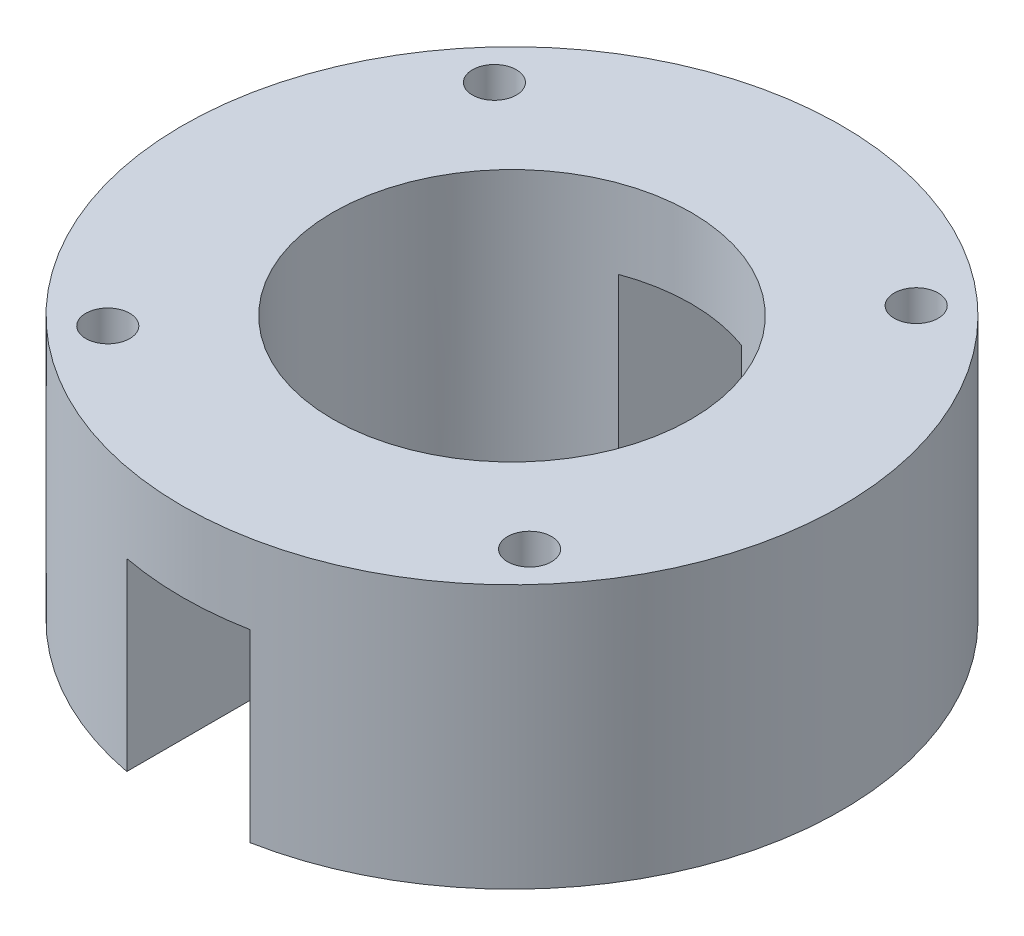
ISO-10303-21;
HEADER;
FILE_DESCRIPTION(('STEP AP214'),'2;1');
FILE_NAME('part.step','',(''),(''),'','','');
FILE_SCHEMA(('AUTOMOTIVE_DESIGN { 1 0 10303 214 1 1 1 1 }'));
ENDSEC;
DATA;
#1=APPLICATION_CONTEXT('core data for automotive mechanical design processes');
#2=APPLICATION_PROTOCOL_DEFINITION('international standard','automotive_design',2000,#1);
#3=PRODUCT_CONTEXT('',#1,'mechanical');
#4=PRODUCT('Part','Part','',(#3));
#5=PRODUCT_RELATED_PRODUCT_CATEGORY('part','',(#4));
#6=PRODUCT_DEFINITION_FORMATION('','',#4);
#7=PRODUCT_DEFINITION_CONTEXT('part definition',#1,'design');
#8=PRODUCT_DEFINITION('design','',#6,#7);
#9=PRODUCT_DEFINITION_SHAPE('','',#8);
#10=(LENGTH_UNIT() NAMED_UNIT(*) SI_UNIT(.MILLI.,.METRE.));
#11=(NAMED_UNIT(*) PLANE_ANGLE_UNIT() SI_UNIT($,.RADIAN.));
#12=(NAMED_UNIT(*) SI_UNIT($,.STERADIAN.) SOLID_ANGLE_UNIT());
#13=UNCERTAINTY_MEASURE_WITH_UNIT(LENGTH_MEASURE(1.E-05),#10,'distance_accuracy_value','');
#14=(GEOMETRIC_REPRESENTATION_CONTEXT(3) GLOBAL_UNCERTAINTY_ASSIGNED_CONTEXT((#13)) GLOBAL_UNIT_ASSIGNED_CONTEXT((#10,
#11,#12)) REPRESENTATION_CONTEXT('',''));
#15=CARTESIAN_POINT('',(0.,0.,0.));
#16=DIRECTION('',(0.,0.,1.));
#17=DIRECTION('',(1.,0.,0.));
#18=AXIS2_PLACEMENT_3D('',#15,#16,#17);
#19=CARTESIAN_POINT('',(7.,21.,-57.5));
#20=DIRECTION('',(0.,1.,0.));
#21=DIRECTION('',(0.,0.,1.));
#22=AXIS2_PLACEMENT_3D('',#19,#20,#21);
#23=PLANE('',#22);
#24=DIRECTION('',(0.,0.,1.));
#25=VECTOR('',#24,1.);
#26=CARTESIAN_POINT('',(7.,21.,-57.5));
#27=LINE('',#26,#25);
#28=CARTESIAN_POINT('',(7.,21.,-36.8408740395773));
#29=VERTEX_POINT('',#28);
#30=CARTESIAN_POINT('',(7.,21.,-19.1460293577832));
#31=VERTEX_POINT('',#30);
#32=EDGE_CURVE('E129',#29,#31,#27,.T.);
#33=ORIENTED_EDGE('',*,*,#32,.T.);
#34=CARTESIAN_POINT('',(0.,21.,0.));
#35=DIRECTION('',(0.,1.,0.));
#36=DIRECTION('',(0.,0.,1.));
#37=AXIS2_PLACEMENT_3D('',#34,#35,#36);
#38=CIRCLE('',#37,20.3855448828109);
#39=CARTESIAN_POINT('',(-7.,21.,-19.1460293577832));
#40=VERTEX_POINT('',#39);
#41=EDGE_CURVE('E123',#31,#40,#38,.T.);
#42=ORIENTED_EDGE('',*,*,#41,.T.);
#43=DIRECTION('',(0.,0.,1.));
#44=VECTOR('',#43,1.);
#45=CARTESIAN_POINT('',(-7.,21.,-57.5));
#46=LINE('',#45,#44);
#47=CARTESIAN_POINT('',(-7.,21.,-36.8408740395773));
#48=VERTEX_POINT('',#47);
#49=EDGE_CURVE('E141',#48,#40,#46,.T.);
#50=ORIENTED_EDGE('',*,*,#49,.F.);
#51=CARTESIAN_POINT('',(0.,21.,0.));
#52=DIRECTION('',(0.,1.,0.));
#53=DIRECTION('',(0.,0.,1.));
#54=AXIS2_PLACEMENT_3D('',#51,#52,#53);
#55=CIRCLE('',#54,37.5);
#56=EDGE_CURVE('E205',#29,#48,#55,.T.);
#57=ORIENTED_EDGE('',*,*,#56,.F.);
#58=EDGE_LOOP('',(#33,#42,#50,#57));
#59=FACE_BOUND('',#58,.T.);
#60=ADVANCED_FACE('F41',(#59),#23,.F.);
#61=CARTESIAN_POINT('',(-7.,-21.,-57.5));
#62=DIRECTION('',(-1.,0.,0.));
#63=DIRECTION('',(0.,-1.,0.));
#64=AXIS2_PLACEMENT_3D('',#61,#62,#63);
#65=PLANE('',#64);
#66=DIRECTION('',(0.,0.,1.));
#67=VECTOR('',#66,1.);
#68=CARTESIAN_POINT('',(-7.,0.,0.));
#69=LINE('',#68,#67);
#70=CARTESIAN_POINT('',(-7.,0.,19.1460293577832));
#71=VERTEX_POINT('',#70);
#72=CARTESIAN_POINT('',(-7.,0.,36.8408740395773));
#73=VERTEX_POINT('',#72);
#74=EDGE_CURVE('E200',#71,#73,#69,.T.);
#75=ORIENTED_EDGE('',*,*,#74,.F.);
#76=DIRECTION('',(0.,1.,0.));
#77=VECTOR('',#76,1.);
#78=CARTESIAN_POINT('',(-7.,-27.5,19.1460293577832));
#79=LINE('',#78,#77);
#80=CARTESIAN_POINT('',(-7.,21.,19.1460293577832));
#81=VERTEX_POINT('',#80);
#82=EDGE_CURVE('E218',#71,#81,#79,.T.);
#83=ORIENTED_EDGE('',*,*,#82,.T.);
#84=CARTESIAN_POINT('',(-7.,21.,36.8408740395773));
#85=VERTEX_POINT('',#84);
#86=EDGE_CURVE('E120',#81,#85,#46,.T.);
#87=ORIENTED_EDGE('',*,*,#86,.T.);
#88=DIRECTION('',(0.,-1.,0.));
#89=VECTOR('',#88,1.);
#90=CARTESIAN_POINT('',(-7.,30.,36.8408740395773));
#91=LINE('',#90,#89);
#92=EDGE_CURVE('E148',#73,#85,#91,.F.);
#93=ORIENTED_EDGE('',*,*,#92,.F.);
#94=EDGE_LOOP('',(#75,#83,#87,#93));
#95=FACE_BOUND('',#94,.T.);
#96=ADVANCED_FACE('F217',(#95),#65,.F.);
#97=CARTESIAN_POINT('',(7.,-21.,-57.5));
#98=DIRECTION('',(1.,0.,0.));
#99=DIRECTION('',(0.,0.,-1.));
#100=AXIS2_PLACEMENT_3D('',#97,#98,#99);
#101=PLANE('',#100);
#102=DIRECTION('',(0.,0.,-1.));
#103=VECTOR('',#102,1.);
#104=CARTESIAN_POINT('',(7.,0.,0.));
#105=LINE('',#104,#103);
#106=CARTESIAN_POINT('',(7.,0.,-19.1460293577832));
#107=VERTEX_POINT('',#106);
#108=CARTESIAN_POINT('',(7.,0.,-36.8408740395773));
#109=VERTEX_POINT('',#108);
#110=EDGE_CURVE('E64',#107,#109,#105,.T.);
#111=ORIENTED_EDGE('',*,*,#110,.F.);
#112=DIRECTION('',(0.,1.,0.));
#113=VECTOR('',#112,1.);
#114=CARTESIAN_POINT('',(7.,-27.5,-19.1460293577832));
#115=LINE('',#114,#113);
#116=EDGE_CURVE('E11',#107,#31,#115,.T.);
#117=ORIENTED_EDGE('',*,*,#116,.T.);
#118=ORIENTED_EDGE('',*,*,#32,.F.);
#119=DIRECTION('',(0.,-1.,0.));
#120=VECTOR('',#119,1.);
#121=CARTESIAN_POINT('',(7.,30.,-36.8408740395773));
#122=LINE('',#121,#120);
#123=EDGE_CURVE('E142',#109,#29,#122,.F.);
#124=ORIENTED_EDGE('',*,*,#123,.F.);
#125=EDGE_LOOP('',(#111,#117,#118,#124));
#126=FACE_BOUND('',#125,.T.);
#127=ADVANCED_FACE('F249',(#126),#101,.F.);
#128=CARTESIAN_POINT('',(0.,0.,0.));
#129=DIRECTION('',(0.,1.,0.));
#130=DIRECTION('',(0.,0.,1.));
#131=AXIS2_PLACEMENT_3D('',#128,#129,#130);
#132=PLANE('',#131);
#133=CARTESIAN_POINT('',(-7.,0.,-36.8408740395773));
#134=VERTEX_POINT('',#133);
#135=CARTESIAN_POINT('',(-7.,0.,-19.1460293577832));
#136=VERTEX_POINT('',#135);
#137=EDGE_CURVE('E201',#134,#136,#69,.T.);
#138=ORIENTED_EDGE('',*,*,#137,.T.);
#139=CARTESIAN_POINT('',(0.,0.,0.));
#140=DIRECTION('',(0.,1.,0.));
#141=DIRECTION('',(0.,0.,1.));
#142=AXIS2_PLACEMENT_3D('',#139,#140,#141);
#143=CIRCLE('',#142,20.3855448828109);
#144=EDGE_CURVE('E232',#136,#71,#143,.T.);
#145=ORIENTED_EDGE('',*,*,#144,.T.);
#146=ORIENTED_EDGE('',*,*,#74,.T.);
#147=CARTESIAN_POINT('',(0.,0.,0.));
#148=DIRECTION('',(0.,1.,0.));
#149=DIRECTION('',(0.,0.,1.));
#150=AXIS2_PLACEMENT_3D('',#147,#148,#149);
#151=CIRCLE('',#150,37.5);
#152=EDGE_CURVE('E185',#134,#73,#151,.T.);
#153=ORIENTED_EDGE('',*,*,#152,.F.);
#154=EDGE_LOOP('',(#138,#145,#146,#153));
#155=FACE_BOUND('',#154,.T.);
#156=ADVANCED_FACE('F273',(#155),#132,.F.);
#157=CARTESIAN_POINT('',(0.,30.,0.));
#158=DIRECTION('',(0.,-1.,0.));
#159=DIRECTION('',(0.,0.,-1.));
#160=AXIS2_PLACEMENT_3D('',#157,#158,#159);
#161=CYLINDRICAL_SURFACE('',#160,37.5);
#162=CARTESIAN_POINT('',(0.,30.,0.));
#163=DIRECTION('',(0.,1.,0.));
#164=DIRECTION('',(0.,0.,1.));
#165=AXIS2_PLACEMENT_3D('',#162,#163,#164);
#166=CIRCLE('',#165,37.5);
#167=CARTESIAN_POINT('',(0.,30.,37.5));
#168=VERTEX_POINT('',#167);
#169=EDGE_CURVE('E189',#168,#168,#166,.T.);
#170=ORIENTED_EDGE('',*,*,#169,.F.);
#171=EDGE_LOOP('',(#170));
#172=FACE_BOUND('',#171,.T.);
#173=ORIENTED_EDGE('',*,*,#152,.T.);
#174=ORIENTED_EDGE('',*,*,#92,.T.);
#175=CARTESIAN_POINT('',(7.,21.,36.8408740395773));
#176=VERTEX_POINT('',#175);
#177=EDGE_CURVE('E113',#85,#176,#55,.T.);
#178=ORIENTED_EDGE('',*,*,#177,.T.);
#179=DIRECTION('',(0.,-1.,0.));
#180=VECTOR('',#179,1.);
#181=CARTESIAN_POINT('',(7.,30.,36.8408740395773));
#182=LINE('',#181,#180);
#183=CARTESIAN_POINT('',(7.,0.,36.8408740395773));
#184=VERTEX_POINT('',#183);
#185=EDGE_CURVE('E126',#176,#184,#182,.T.);
#186=ORIENTED_EDGE('',*,*,#185,.T.);
#187=EDGE_CURVE('E193',#184,#109,#151,.T.);
#188=ORIENTED_EDGE('',*,*,#187,.T.);
#189=ORIENTED_EDGE('',*,*,#123,.T.);
#190=ORIENTED_EDGE('',*,*,#56,.T.);
#191=DIRECTION('',(0.,-1.,0.));
#192=VECTOR('',#191,1.);
#193=CARTESIAN_POINT('',(-7.,30.,-36.8408740395773));
#194=LINE('',#193,#192);
#195=EDGE_CURVE('E152',#48,#134,#194,.T.);
#196=ORIENTED_EDGE('',*,*,#195,.T.);
#197=EDGE_LOOP('',(#173,#174,#178,#186,#188,#189,#190,#196));
#198=FACE_BOUND('',#197,.T.);
#199=ADVANCED_FACE('F43',(#172,#198),#161,.T.);
#200=CARTESIAN_POINT('',(0.,30.,0.));
#201=DIRECTION('',(0.,1.,0.));
#202=DIRECTION('',(0.,0.,1.));
#203=AXIS2_PLACEMENT_3D('',#200,#201,#202);
#204=PLANE('',#203);
#205=CARTESIAN_POINT('',(0.,30.,0.));
#206=DIRECTION('',(0.,1.,0.));
#207=DIRECTION('',(0.,0.,1.));
#208=AXIS2_PLACEMENT_3D('',#205,#206,#207);
#209=CIRCLE('',#208,20.3855448828109);
#210=CARTESIAN_POINT('',(0.,30.,20.3855448828109));
#211=VERTEX_POINT('',#210);
#212=EDGE_CURVE('E130',#211,#211,#209,.T.);
#213=ORIENTED_EDGE('',*,*,#212,.F.);
#214=EDGE_LOOP('',(#213));
#215=FACE_BOUND('',#214,.T.);
#216=CARTESIAN_POINT('',(-23.9999999999998,30.,-22.0000000000002));
#217=DIRECTION('',(0.,1.,0.));
#218=DIRECTION('',(0.,0.,1.));
#219=AXIS2_PLACEMENT_3D('',#216,#217,#218);
#220=CIRCLE('',#219,2.5);
#221=CARTESIAN_POINT('',(-23.9999999999998,30.,-19.5000000000002));
#222=VERTEX_POINT('',#221);
#223=EDGE_CURVE('E174',#222,#222,#220,.T.);
#224=ORIENTED_EDGE('',*,*,#223,.F.);
#225=EDGE_LOOP('',(#224));
#226=FACE_BOUND('',#225,.T.);
#227=CARTESIAN_POINT('',(-22.0000000000002,30.,23.9999999999998));
#228=DIRECTION('',(0.,1.,0.));
#229=DIRECTION('',(0.,0.,1.));
#230=AXIS2_PLACEMENT_3D('',#227,#228,#229);
#231=CIRCLE('',#230,2.5);
#232=CARTESIAN_POINT('',(-22.0000000000002,30.,26.4999999999999));
#233=VERTEX_POINT('',#232);
#234=EDGE_CURVE('E166',#233,#233,#231,.T.);
#235=ORIENTED_EDGE('',*,*,#234,.F.);
#236=EDGE_LOOP('',(#235));
#237=FACE_BOUND('',#236,.T.);
#238=CARTESIAN_POINT('',(23.9999999999999,30.,22.0000000000001));
#239=DIRECTION('',(0.,1.,0.));
#240=DIRECTION('',(0.,0.,1.));
#241=AXIS2_PLACEMENT_3D('',#238,#239,#240);
#242=CIRCLE('',#241,2.5);
#243=CARTESIAN_POINT('',(23.9999999999999,30.,24.5000000000001));
#244=VERTEX_POINT('',#243);
#245=EDGE_CURVE('E157',#244,#244,#242,.T.);
#246=ORIENTED_EDGE('',*,*,#245,.F.);
#247=EDGE_LOOP('',(#246));
#248=FACE_BOUND('',#247,.T.);
#249=CARTESIAN_POINT('',(22.,30.,-24.));
#250=DIRECTION('',(0.,1.,0.));
#251=DIRECTION('',(0.,0.,1.));
#252=AXIS2_PLACEMENT_3D('',#249,#250,#251);
#253=CIRCLE('',#252,2.5);
#254=CARTESIAN_POINT('',(22.,30.,-21.5));
#255=VERTEX_POINT('',#254);
#256=EDGE_CURVE('E161',#255,#255,#253,.T.);
#257=ORIENTED_EDGE('',*,*,#256,.F.);
#258=EDGE_LOOP('',(#257));
#259=FACE_BOUND('',#258,.T.);
#260=ORIENTED_EDGE('',*,*,#169,.T.);
#261=EDGE_LOOP('',(#260));
#262=FACE_BOUND('',#261,.T.);
#263=ADVANCED_FACE('F280',(#215,#226,#237,#248,#259,#262),#204,.T.);
#264=CARTESIAN_POINT('',(7.,0.,19.1460293577832));
#265=VERTEX_POINT('',#264);
#266=EDGE_CURVE('E197',#184,#265,#105,.T.);
#267=ORIENTED_EDGE('',*,*,#266,.T.);
#268=CARTESIAN_POINT('',(0.,0.,0.));
#269=DIRECTION('',(0.,1.,0.));
#270=DIRECTION('',(0.,0.,1.));
#271=AXIS2_PLACEMENT_3D('',#268,#269,#270);
#272=CIRCLE('',#271,20.3855448828109);
#273=EDGE_CURVE('E57',#265,#107,#272,.T.);
#274=ORIENTED_EDGE('',*,*,#273,.T.);
#275=ORIENTED_EDGE('',*,*,#110,.T.);
#276=ORIENTED_EDGE('',*,*,#187,.F.);
#277=EDGE_LOOP('',(#267,#274,#275,#276));
#278=FACE_BOUND('',#277,.T.);
#279=ADVANCED_FACE('F247',(#278),#132,.F.);
#280=CARTESIAN_POINT('',(22.,5.,-24.));
#281=DIRECTION('',(0.,1.,0.));
#282=DIRECTION('',(0.,0.,1.));
#283=AXIS2_PLACEMENT_3D('',#280,#281,#282);
#284=CYLINDRICAL_SURFACE('',#283,2.5);
#285=CARTESIAN_POINT('',(22.,5.,-24.));
#286=DIRECTION('',(0.,1.,0.));
#287=DIRECTION('',(0.,0.,1.));
#288=AXIS2_PLACEMENT_3D('',#285,#286,#287);
#289=CIRCLE('',#288,2.5);
#290=CARTESIAN_POINT('',(22.,5.,-21.5));
#291=VERTEX_POINT('',#290);
#292=EDGE_CURVE('E181',#291,#291,#289,.T.);
#293=ORIENTED_EDGE('',*,*,#292,.F.);
#294=EDGE_LOOP('',(#293));
#295=FACE_BOUND('',#294,.T.);
#296=ORIENTED_EDGE('',*,*,#256,.T.);
#297=EDGE_LOOP('',(#296));
#298=FACE_BOUND('',#297,.T.);
#299=ADVANCED_FACE('F285',(#295,#298),#284,.F.);
#300=CARTESIAN_POINT('',(22.,5.,-24.));
#301=DIRECTION('',(0.,1.,0.));
#302=DIRECTION('',(0.,0.,1.));
#303=AXIS2_PLACEMENT_3D('',#300,#301,#302);
#304=PLANE('',#303);
#305=ORIENTED_EDGE('',*,*,#292,.T.);
#306=EDGE_LOOP('',(#305));
#307=FACE_BOUND('',#306,.T.);
#308=ADVANCED_FACE('F310',(#307),#304,.T.);
#309=CARTESIAN_POINT('',(23.9999999999999,5.,22.0000000000001));
#310=DIRECTION('',(0.,1.,0.));
#311=DIRECTION('',(0.,0.,1.));
#312=AXIS2_PLACEMENT_3D('',#309,#310,#311);
#313=CYLINDRICAL_SURFACE('',#312,2.5);
#314=CARTESIAN_POINT('',(23.9999999999999,5.,22.0000000000001));
#315=DIRECTION('',(0.,1.,0.));
#316=DIRECTION('',(0.,0.,1.));
#317=AXIS2_PLACEMENT_3D('',#314,#315,#316);
#318=CIRCLE('',#317,2.5);
#319=CARTESIAN_POINT('',(23.9999999999999,5.,24.5000000000001));
#320=VERTEX_POINT('',#319);
#321=EDGE_CURVE('E162',#320,#320,#318,.T.);
#322=ORIENTED_EDGE('',*,*,#321,.F.);
#323=EDGE_LOOP('',(#322));
#324=FACE_BOUND('',#323,.T.);
#325=ORIENTED_EDGE('',*,*,#245,.T.);
#326=EDGE_LOOP('',(#325));
#327=FACE_BOUND('',#326,.T.);
#328=ADVANCED_FACE('F313',(#324,#327),#313,.F.);
#329=CARTESIAN_POINT('',(23.9999999999999,5.,22.0000000000001));
#330=DIRECTION('',(0.,1.,0.));
#331=DIRECTION('',(0.,0.,1.));
#332=AXIS2_PLACEMENT_3D('',#329,#330,#331);
#333=PLANE('',#332);
#334=ORIENTED_EDGE('',*,*,#321,.T.);
#335=EDGE_LOOP('',(#334));
#336=FACE_BOUND('',#335,.T.);
#337=ADVANCED_FACE('F334',(#336),#333,.T.);
#338=CARTESIAN_POINT('',(-22.0000000000002,5.,23.9999999999998));
#339=DIRECTION('',(0.,1.,0.));
#340=DIRECTION('',(0.,0.,1.));
#341=AXIS2_PLACEMENT_3D('',#338,#339,#340);
#342=CYLINDRICAL_SURFACE('',#341,2.5);
#343=CARTESIAN_POINT('',(-22.0000000000002,5.,23.9999999999998));
#344=DIRECTION('',(0.,1.,0.));
#345=DIRECTION('',(0.,0.,1.));
#346=AXIS2_PLACEMENT_3D('',#343,#344,#345);
#347=CIRCLE('',#346,2.5);
#348=CARTESIAN_POINT('',(-22.0000000000002,5.,26.4999999999999));
#349=VERTEX_POINT('',#348);
#350=EDGE_CURVE('E170',#349,#349,#347,.T.);
#351=ORIENTED_EDGE('',*,*,#350,.F.);
#352=EDGE_LOOP('',(#351));
#353=FACE_BOUND('',#352,.T.);
#354=ORIENTED_EDGE('',*,*,#234,.T.);
#355=EDGE_LOOP('',(#354));
#356=FACE_BOUND('',#355,.T.);
#357=ADVANCED_FACE('F340',(#353,#356),#342,.F.);
#358=CARTESIAN_POINT('',(-22.0000000000002,5.,23.9999999999998));
#359=DIRECTION('',(0.,1.,0.));
#360=DIRECTION('',(0.,0.,1.));
#361=AXIS2_PLACEMENT_3D('',#358,#359,#360);
#362=PLANE('',#361);
#363=ORIENTED_EDGE('',*,*,#350,.T.);
#364=EDGE_LOOP('',(#363));
#365=FACE_BOUND('',#364,.T.);
#366=ADVANCED_FACE('F305',(#365),#362,.T.);
#367=CARTESIAN_POINT('',(-23.9999999999998,5.,-22.0000000000002));
#368=DIRECTION('',(0.,1.,0.));
#369=DIRECTION('',(0.,0.,1.));
#370=AXIS2_PLACEMENT_3D('',#367,#368,#369);
#371=CYLINDRICAL_SURFACE('',#370,2.5);
#372=CARTESIAN_POINT('',(-23.9999999999998,5.,-22.0000000000002));
#373=DIRECTION('',(0.,1.,0.));
#374=DIRECTION('',(0.,0.,1.));
#375=AXIS2_PLACEMENT_3D('',#372,#373,#374);
#376=CIRCLE('',#375,2.5);
#377=CARTESIAN_POINT('',(-23.9999999999998,5.,-19.5000000000002));
#378=VERTEX_POINT('',#377);
#379=EDGE_CURVE('E156',#378,#378,#376,.T.);
#380=ORIENTED_EDGE('',*,*,#379,.F.);
#381=EDGE_LOOP('',(#380));
#382=FACE_BOUND('',#381,.T.);
#383=ORIENTED_EDGE('',*,*,#223,.T.);
#384=EDGE_LOOP('',(#383));
#385=FACE_BOUND('',#384,.T.);
#386=ADVANCED_FACE('F299',(#382,#385),#371,.F.);
#387=CARTESIAN_POINT('',(-23.9999999999998,5.,-22.0000000000002));
#388=DIRECTION('',(0.,1.,0.));
#389=DIRECTION('',(0.,0.,1.));
#390=AXIS2_PLACEMENT_3D('',#387,#388,#389);
#391=PLANE('',#390);
#392=ORIENTED_EDGE('',*,*,#379,.T.);
#393=EDGE_LOOP('',(#392));
#394=FACE_BOUND('',#393,.T.);
#395=ADVANCED_FACE('F294',(#394),#391,.T.);
#396=ORIENTED_EDGE('',*,*,#86,.F.);
#397=CARTESIAN_POINT('',(7.,21.,19.1460293577832));
#398=VERTEX_POINT('',#397);
#399=EDGE_CURVE('E107',#81,#398,#38,.T.);
#400=ORIENTED_EDGE('',*,*,#399,.T.);
#401=EDGE_CURVE('E118',#398,#176,#27,.T.);
#402=ORIENTED_EDGE('',*,*,#401,.T.);
#403=ORIENTED_EDGE('',*,*,#177,.F.);
#404=EDGE_LOOP('',(#396,#400,#402,#403));
#405=FACE_BOUND('',#404,.T.);
#406=ADVANCED_FACE('F116',(#405),#23,.F.);
#407=ORIENTED_EDGE('',*,*,#49,.T.);
#408=DIRECTION('',(0.,1.,0.));
#409=VECTOR('',#408,1.);
#410=CARTESIAN_POINT('',(-7.,-27.5,-19.1460293577832));
#411=LINE('',#410,#409);
#412=EDGE_CURVE('E137',#40,#136,#411,.F.);
#413=ORIENTED_EDGE('',*,*,#412,.T.);
#414=ORIENTED_EDGE('',*,*,#137,.F.);
#415=ORIENTED_EDGE('',*,*,#195,.F.);
#416=EDGE_LOOP('',(#407,#413,#414,#415));
#417=FACE_BOUND('',#416,.T.);
#418=ADVANCED_FACE('F227',(#417),#65,.F.);
#419=ORIENTED_EDGE('',*,*,#401,.F.);
#420=DIRECTION('',(0.,1.,0.));
#421=VECTOR('',#420,1.);
#422=CARTESIAN_POINT('',(7.,-27.5,19.1460293577832));
#423=LINE('',#422,#421);
#424=EDGE_CURVE('E50',#398,#265,#423,.F.);
#425=ORIENTED_EDGE('',*,*,#424,.T.);
#426=ORIENTED_EDGE('',*,*,#266,.F.);
#427=ORIENTED_EDGE('',*,*,#185,.F.);
#428=EDGE_LOOP('',(#419,#425,#426,#427));
#429=FACE_BOUND('',#428,.T.);
#430=ADVANCED_FACE('F124',(#429),#101,.F.);
#431=CARTESIAN_POINT('',(0.,-27.5,0.));
#432=DIRECTION('',(0.,1.,0.));
#433=DIRECTION('',(0.,0.,1.));
#434=AXIS2_PLACEMENT_3D('',#431,#432,#433);
#435=CYLINDRICAL_SURFACE('',#434,20.3855448828109);
#436=ORIENTED_EDGE('',*,*,#212,.T.);
#437=EDGE_LOOP('',(#436));
#438=FACE_BOUND('',#437,.T.);
#439=ORIENTED_EDGE('',*,*,#41,.F.);
#440=ORIENTED_EDGE('',*,*,#116,.F.);
#441=ORIENTED_EDGE('',*,*,#273,.F.);
#442=ORIENTED_EDGE('',*,*,#424,.F.);
#443=ORIENTED_EDGE('',*,*,#399,.F.);
#444=ORIENTED_EDGE('',*,*,#82,.F.);
#445=ORIENTED_EDGE('',*,*,#144,.F.);
#446=ORIENTED_EDGE('',*,*,#412,.F.);
#447=EDGE_LOOP('',(#439,#440,#441,#442,#443,#444,#445,#446));
#448=FACE_BOUND('',#447,.T.);
#449=ADVANCED_FACE('F106',(#438,#448),#435,.F.);
#450=CLOSED_SHELL('',(#60,#96,#127,#156,#199,#263,#279,#299,#308,#328,#337,#357,#366,#386,#395,
#406,#418,#430,#449));
#451=MANIFOLD_SOLID_BREP('B2',#450);
#452=ADVANCED_BREP_SHAPE_REPRESENTATION('',(#18,#451),#14);
#453=SHAPE_DEFINITION_REPRESENTATION(#9,#452);
ENDSEC;
END-ISO-10303-21;
